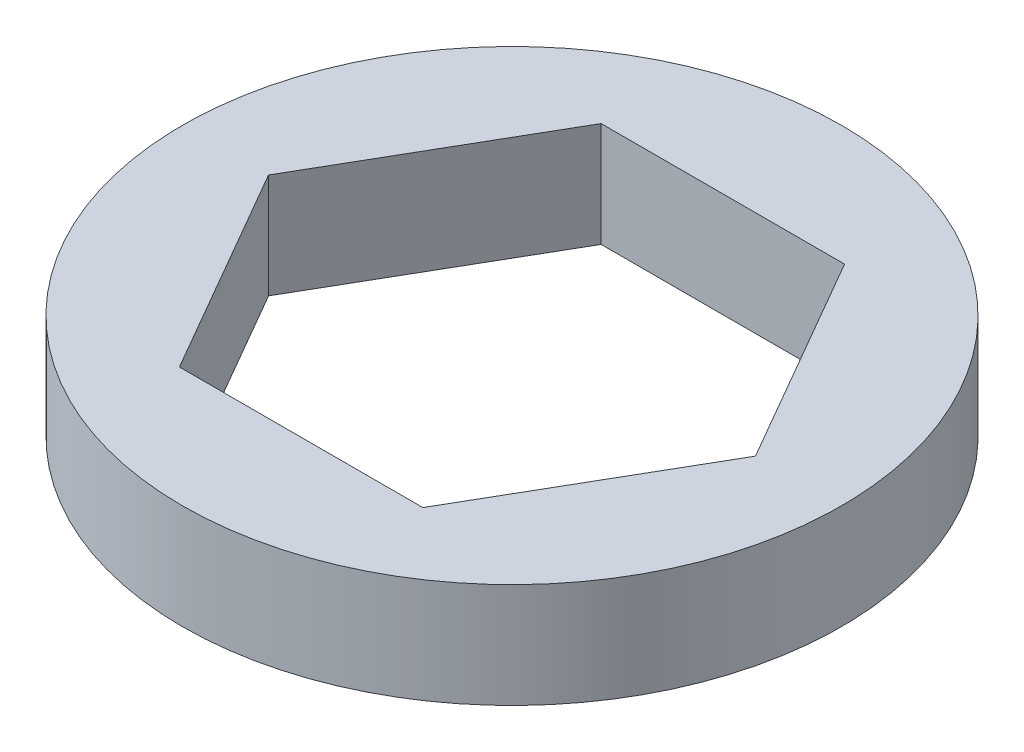
ISO-10303-21;
HEADER;
FILE_DESCRIPTION(('STEP AP214'),'2;1');
FILE_NAME('part.step','',(''),(''),'','','');
FILE_SCHEMA(('AUTOMOTIVE_DESIGN { 1 0 10303 214 1 1 1 1 }'));
ENDSEC;
DATA;
#1=APPLICATION_CONTEXT('core data for automotive mechanical design processes');
#2=APPLICATION_PROTOCOL_DEFINITION('international standard','automotive_design',2000,#1);
#3=PRODUCT_CONTEXT('',#1,'mechanical');
#4=PRODUCT('Part','Part','',(#3));
#5=PRODUCT_RELATED_PRODUCT_CATEGORY('part','',(#4));
#6=PRODUCT_DEFINITION_FORMATION('','',#4);
#7=PRODUCT_DEFINITION_CONTEXT('part definition',#1,'design');
#8=PRODUCT_DEFINITION('design','',#6,#7);
#9=PRODUCT_DEFINITION_SHAPE('','',#8);
#10=(LENGTH_UNIT() NAMED_UNIT(*) SI_UNIT(.MILLI.,.METRE.));
#11=(NAMED_UNIT(*) PLANE_ANGLE_UNIT() SI_UNIT($,.RADIAN.));
#12=(NAMED_UNIT(*) SI_UNIT($,.STERADIAN.) SOLID_ANGLE_UNIT());
#13=UNCERTAINTY_MEASURE_WITH_UNIT(LENGTH_MEASURE(1.E-05),#10,'distance_accuracy_value','');
#14=(GEOMETRIC_REPRESENTATION_CONTEXT(3) GLOBAL_UNCERTAINTY_ASSIGNED_CONTEXT((#13)) GLOBAL_UNIT_ASSIGNED_CONTEXT((#10,
#11,#12)) REPRESENTATION_CONTEXT('',''));
#15=CARTESIAN_POINT('',(0.,0.,0.));
#16=DIRECTION('',(0.,0.,1.));
#17=DIRECTION('',(1.,0.,0.));
#18=AXIS2_PLACEMENT_3D('',#15,#16,#17);
#19=CARTESIAN_POINT('',(0.,3.175,0.));
#20=DIRECTION('',(0.,1.,0.));
#21=DIRECTION('',(0.,0.,1.));
#22=AXIS2_PLACEMENT_3D('',#19,#20,#21);
#23=PLANE('',#22);
#24=CARTESIAN_POINT('',(0.,3.175,0.));
#25=DIRECTION('',(0.,1.,0.));
#26=DIRECTION('',(0.,0.,1.));
#27=AXIS2_PLACEMENT_3D('',#24,#25,#26);
#28=CIRCLE('',#27,9.9949);
#29=CARTESIAN_POINT('',(0.,3.175,9.9949));
#30=VERTEX_POINT('',#29);
#31=EDGE_CURVE('E11',#30,#30,#28,.T.);
#32=ORIENTED_EDGE('',*,*,#31,.T.);
#33=EDGE_LOOP('',(#32));
#34=FACE_BOUND('',#33,.T.);
#35=DIRECTION('',(-0.500000000000001,0.,-0.866025403784438));
#36=VECTOR('',#35,1.);
#37=CARTESIAN_POINT('',(7.38367485763918,3.175,0.));
#38=LINE('',#37,#36);
#39=CARTESIAN_POINT('',(7.38367485763918,3.175,0.));
#40=VERTEX_POINT('',#39);
#41=CARTESIAN_POINT('',(3.69183742881957,3.175,-6.39444999999998));
#42=VERTEX_POINT('',#41);
#43=EDGE_CURVE('E95',#40,#42,#38,.T.);
#44=ORIENTED_EDGE('',*,*,#43,.F.);
#45=DIRECTION('',(0.499999999999995,0.,-0.866025403784441));
#46=VECTOR('',#45,1.);
#47=CARTESIAN_POINT('',(3.69183742881966,3.175,6.39444999999993));
#48=LINE('',#47,#46);
#49=CARTESIAN_POINT('',(3.69183742881966,3.175,6.39444999999993));
#50=VERTEX_POINT('',#49);
#51=EDGE_CURVE('E87',#50,#40,#48,.T.);
#52=ORIENTED_EDGE('',*,*,#51,.F.);
#53=DIRECTION('',(1.,0.,0.));
#54=VECTOR('',#53,1.);
#55=CARTESIAN_POINT('',(-3.69183742881953,3.175,6.39445000000001));
#56=LINE('',#55,#54);
#57=CARTESIAN_POINT('',(-3.69183742881953,3.175,6.39445000000001));
#58=VERTEX_POINT('',#57);
#59=EDGE_CURVE('E115',#58,#50,#56,.T.);
#60=ORIENTED_EDGE('',*,*,#59,.F.);
#61=DIRECTION('',(0.500000000000007,0.,0.866025403784434));
#62=VECTOR('',#61,1.);
#63=CARTESIAN_POINT('',(-7.38367485763918,3.175,0.));
#64=LINE('',#63,#62);
#65=CARTESIAN_POINT('',(-7.38367485763918,3.175,0.));
#66=VERTEX_POINT('',#65);
#67=EDGE_CURVE('E113',#66,#58,#64,.T.);
#68=ORIENTED_EDGE('',*,*,#67,.F.);
#69=DIRECTION('',(-0.499999999999995,0.,0.866025403784442));
#70=VECTOR('',#69,1.);
#71=CARTESIAN_POINT('',(-3.69183742881962,3.175,-6.39444999999996));
#72=LINE('',#71,#70);
#73=CARTESIAN_POINT('',(-3.69183742881962,3.175,-6.39444999999996));
#74=VERTEX_POINT('',#73);
#75=EDGE_CURVE('E109',#74,#66,#72,.T.);
#76=ORIENTED_EDGE('',*,*,#75,.F.);
#77=DIRECTION('',(-1.,0.,0.));
#78=VECTOR('',#77,1.);
#79=CARTESIAN_POINT('',(3.69183742881957,3.175,-6.39444999999998));
#80=LINE('',#79,#78);
#81=EDGE_CURVE('E107',#42,#74,#80,.T.);
#82=ORIENTED_EDGE('',*,*,#81,.F.);
#83=EDGE_LOOP('',(#44,#52,#60,#68,#76,#82));
#84=FACE_BOUND('',#83,.T.);
#85=ADVANCED_FACE('F34',(#34,#84),#23,.T.);
#86=CARTESIAN_POINT('',(0.,0.,0.));
#87=DIRECTION('',(0.,1.,0.));
#88=DIRECTION('',(0.,0.,1.));
#89=AXIS2_PLACEMENT_3D('',#86,#87,#88);
#90=PLANE('',#89);
#91=CARTESIAN_POINT('',(0.,0.,0.));
#92=DIRECTION('',(0.,1.,0.));
#93=DIRECTION('',(0.,0.,1.));
#94=AXIS2_PLACEMENT_3D('',#91,#92,#93);
#95=CIRCLE('',#94,9.9949);
#96=CARTESIAN_POINT('',(0.,0.,9.9949));
#97=VERTEX_POINT('',#96);
#98=EDGE_CURVE('E38',#97,#97,#95,.T.);
#99=ORIENTED_EDGE('',*,*,#98,.F.);
#100=EDGE_LOOP('',(#99));
#101=FACE_BOUND('',#100,.T.);
#102=DIRECTION('',(0.499999999999995,0.,-0.866025403784441));
#103=VECTOR('',#102,1.);
#104=CARTESIAN_POINT('',(3.69183742881966,0.,6.39444999999993));
#105=LINE('',#104,#103);
#106=CARTESIAN_POINT('',(3.69183742881966,0.,6.39444999999993));
#107=VERTEX_POINT('',#106);
#108=CARTESIAN_POINT('',(7.38367485763918,0.,0.));
#109=VERTEX_POINT('',#108);
#110=EDGE_CURVE('E57',#107,#109,#105,.T.);
#111=ORIENTED_EDGE('',*,*,#110,.T.);
#112=DIRECTION('',(-0.500000000000001,0.,-0.866025403784438));
#113=VECTOR('',#112,1.);
#114=CARTESIAN_POINT('',(7.38367485763918,0.,0.));
#115=LINE('',#114,#113);
#116=CARTESIAN_POINT('',(3.69183742881957,0.,-6.39444999999998));
#117=VERTEX_POINT('',#116);
#118=EDGE_CURVE('E102',#109,#117,#115,.T.);
#119=ORIENTED_EDGE('',*,*,#118,.T.);
#120=DIRECTION('',(-1.,0.,0.));
#121=VECTOR('',#120,1.);
#122=CARTESIAN_POINT('',(3.69183742881957,0.,-6.39444999999998));
#123=LINE('',#122,#121);
#124=CARTESIAN_POINT('',(-3.69183742881962,0.,-6.39444999999996));
#125=VERTEX_POINT('',#124);
#126=EDGE_CURVE('E119',#117,#125,#123,.T.);
#127=ORIENTED_EDGE('',*,*,#126,.T.);
#128=DIRECTION('',(-0.499999999999995,0.,0.866025403784442));
#129=VECTOR('',#128,1.);
#130=CARTESIAN_POINT('',(-3.69183742881962,0.,-6.39444999999996));
#131=LINE('',#130,#129);
#132=CARTESIAN_POINT('',(-7.38367485763918,0.,0.));
#133=VERTEX_POINT('',#132);
#134=EDGE_CURVE('E122',#125,#133,#131,.T.);
#135=ORIENTED_EDGE('',*,*,#134,.T.);
#136=DIRECTION('',(0.500000000000007,0.,0.866025403784434));
#137=VECTOR('',#136,1.);
#138=CARTESIAN_POINT('',(-7.38367485763918,0.,0.));
#139=LINE('',#138,#137);
#140=CARTESIAN_POINT('',(-3.69183742881953,0.,6.39445000000001));
#141=VERTEX_POINT('',#140);
#142=EDGE_CURVE('E125',#133,#141,#139,.T.);
#143=ORIENTED_EDGE('',*,*,#142,.T.);
#144=DIRECTION('',(1.,0.,0.));
#145=VECTOR('',#144,1.);
#146=CARTESIAN_POINT('',(-3.69183742881953,0.,6.39445000000001));
#147=LINE('',#146,#145);
#148=EDGE_CURVE('E96',#141,#107,#147,.T.);
#149=ORIENTED_EDGE('',*,*,#148,.T.);
#150=EDGE_LOOP('',(#111,#119,#127,#135,#143,#149));
#151=FACE_BOUND('',#150,.T.);
#152=ADVANCED_FACE('F142',(#101,#151),#90,.F.);
#153=CARTESIAN_POINT('',(0.,3.175,0.));
#154=DIRECTION('',(0.,-1.,0.));
#155=DIRECTION('',(0.,0.,-1.));
#156=AXIS2_PLACEMENT_3D('',#153,#154,#155);
#157=CYLINDRICAL_SURFACE('',#156,9.9949);
#158=ORIENTED_EDGE('',*,*,#31,.F.);
#159=EDGE_LOOP('',(#158));
#160=FACE_BOUND('',#159,.T.);
#161=ORIENTED_EDGE('',*,*,#98,.T.);
#162=EDGE_LOOP('',(#161));
#163=FACE_BOUND('',#162,.T.);
#164=ADVANCED_FACE('F36',(#160,#163),#157,.T.);
#165=CARTESIAN_POINT('',(3.69183742881966,3.175,6.39444999999993));
#166=DIRECTION('',(-0.866025403784441,0.,-0.499999999999995));
#167=DIRECTION('',(-0.499999999999995,0.,0.866025403784441));
#168=AXIS2_PLACEMENT_3D('',#165,#166,#167);
#169=PLANE('',#168);
#170=ORIENTED_EDGE('',*,*,#110,.F.);
#171=DIRECTION('',(0.,-1.,0.));
#172=VECTOR('',#171,1.);
#173=CARTESIAN_POINT('',(3.69183742881966,3.175,6.39444999999993));
#174=LINE('',#173,#172);
#175=EDGE_CURVE('E91',#50,#107,#174,.T.);
#176=ORIENTED_EDGE('',*,*,#175,.F.);
#177=ORIENTED_EDGE('',*,*,#51,.T.);
#178=DIRECTION('',(0.,-1.,0.));
#179=VECTOR('',#178,1.);
#180=CARTESIAN_POINT('',(7.38367485763918,3.175,0.));
#181=LINE('',#180,#179);
#182=EDGE_CURVE('E90',#40,#109,#181,.T.);
#183=ORIENTED_EDGE('',*,*,#182,.T.);
#184=EDGE_LOOP('',(#170,#176,#177,#183));
#185=FACE_BOUND('',#184,.T.);
#186=ADVANCED_FACE('F89',(#185),#169,.T.);
#187=CARTESIAN_POINT('',(7.38367485763918,3.175,0.));
#188=DIRECTION('',(-0.866025403784438,0.,0.500000000000001));
#189=DIRECTION('',(0.500000000000001,0.,0.866025403784438));
#190=AXIS2_PLACEMENT_3D('',#187,#188,#189);
#191=PLANE('',#190);
#192=ORIENTED_EDGE('',*,*,#118,.F.);
#193=ORIENTED_EDGE('',*,*,#182,.F.);
#194=ORIENTED_EDGE('',*,*,#43,.T.);
#195=DIRECTION('',(0.,-1.,0.));
#196=VECTOR('',#195,1.);
#197=CARTESIAN_POINT('',(3.69183742881957,3.175,-6.39444999999998));
#198=LINE('',#197,#196);
#199=EDGE_CURVE('E103',#42,#117,#198,.T.);
#200=ORIENTED_EDGE('',*,*,#199,.T.);
#201=EDGE_LOOP('',(#192,#193,#194,#200));
#202=FACE_BOUND('',#201,.T.);
#203=ADVANCED_FACE('F99',(#202),#191,.T.);
#204=CARTESIAN_POINT('',(3.69183742881957,3.175,-6.39444999999998));
#205=DIRECTION('',(0.,0.,1.));
#206=DIRECTION('',(1.,0.,0.));
#207=AXIS2_PLACEMENT_3D('',#204,#205,#206);
#208=PLANE('',#207);
#209=ORIENTED_EDGE('',*,*,#126,.F.);
#210=ORIENTED_EDGE('',*,*,#199,.F.);
#211=ORIENTED_EDGE('',*,*,#81,.T.);
#212=DIRECTION('',(0.,-1.,0.));
#213=VECTOR('',#212,1.);
#214=CARTESIAN_POINT('',(-3.69183742881962,3.175,-6.39444999999996));
#215=LINE('',#214,#213);
#216=EDGE_CURVE('E134',#74,#125,#215,.T.);
#217=ORIENTED_EDGE('',*,*,#216,.T.);
#218=EDGE_LOOP('',(#209,#210,#211,#217));
#219=FACE_BOUND('',#218,.T.);
#220=ADVANCED_FACE('F138',(#219),#208,.T.);
#221=CARTESIAN_POINT('',(-3.69183742881962,3.175,-6.39444999999996));
#222=DIRECTION('',(0.866025403784442,0.,0.499999999999995));
#223=DIRECTION('',(0.499999999999995,0.,-0.866025403784442));
#224=AXIS2_PLACEMENT_3D('',#221,#222,#223);
#225=PLANE('',#224);
#226=ORIENTED_EDGE('',*,*,#134,.F.);
#227=ORIENTED_EDGE('',*,*,#216,.F.);
#228=ORIENTED_EDGE('',*,*,#75,.T.);
#229=DIRECTION('',(0.,-1.,0.));
#230=VECTOR('',#229,1.);
#231=CARTESIAN_POINT('',(-7.38367485763918,3.175,0.));
#232=LINE('',#231,#230);
#233=EDGE_CURVE('E132',#66,#133,#232,.T.);
#234=ORIENTED_EDGE('',*,*,#233,.T.);
#235=EDGE_LOOP('',(#226,#227,#228,#234));
#236=FACE_BOUND('',#235,.T.);
#237=ADVANCED_FACE('F150',(#236),#225,.T.);
#238=CARTESIAN_POINT('',(-7.38367485763918,3.175,0.));
#239=DIRECTION('',(0.866025403784435,0.,-0.500000000000007));
#240=DIRECTION('',(-0.500000000000007,0.,-0.866025403784435));
#241=AXIS2_PLACEMENT_3D('',#238,#239,#240);
#242=PLANE('',#241);
#243=ORIENTED_EDGE('',*,*,#142,.F.);
#244=ORIENTED_EDGE('',*,*,#233,.F.);
#245=ORIENTED_EDGE('',*,*,#67,.T.);
#246=DIRECTION('',(0.,-1.,0.));
#247=VECTOR('',#246,1.);
#248=CARTESIAN_POINT('',(-3.69183742881953,3.175,6.39445000000001));
#249=LINE('',#248,#247);
#250=EDGE_CURVE('E49',#58,#141,#249,.T.);
#251=ORIENTED_EDGE('',*,*,#250,.T.);
#252=EDGE_LOOP('',(#243,#244,#245,#251));
#253=FACE_BOUND('',#252,.T.);
#254=ADVANCED_FACE('F148',(#253),#242,.T.);
#255=CARTESIAN_POINT('',(-3.69183742881953,3.175,6.39445000000001));
#256=DIRECTION('',(0.,0.,-1.));
#257=DIRECTION('',(-1.,0.,0.));
#258=AXIS2_PLACEMENT_3D('',#255,#256,#257);
#259=PLANE('',#258);
#260=ORIENTED_EDGE('',*,*,#148,.F.);
#261=ORIENTED_EDGE('',*,*,#250,.F.);
#262=ORIENTED_EDGE('',*,*,#59,.T.);
#263=ORIENTED_EDGE('',*,*,#175,.T.);
#264=EDGE_LOOP('',(#260,#261,#262,#263));
#265=FACE_BOUND('',#264,.T.);
#266=ADVANCED_FACE('F144',(#265),#259,.T.);
#267=CLOSED_SHELL('',(#85,#152,#164,#186,#203,#220,#237,#254,#266));
#268=MANIFOLD_SOLID_BREP('B2',#267);
#269=ADVANCED_BREP_SHAPE_REPRESENTATION('',(#18,#268),#14);
#270=SHAPE_DEFINITION_REPRESENTATION(#9,#269);
ENDSEC;
END-ISO-10303-21;
